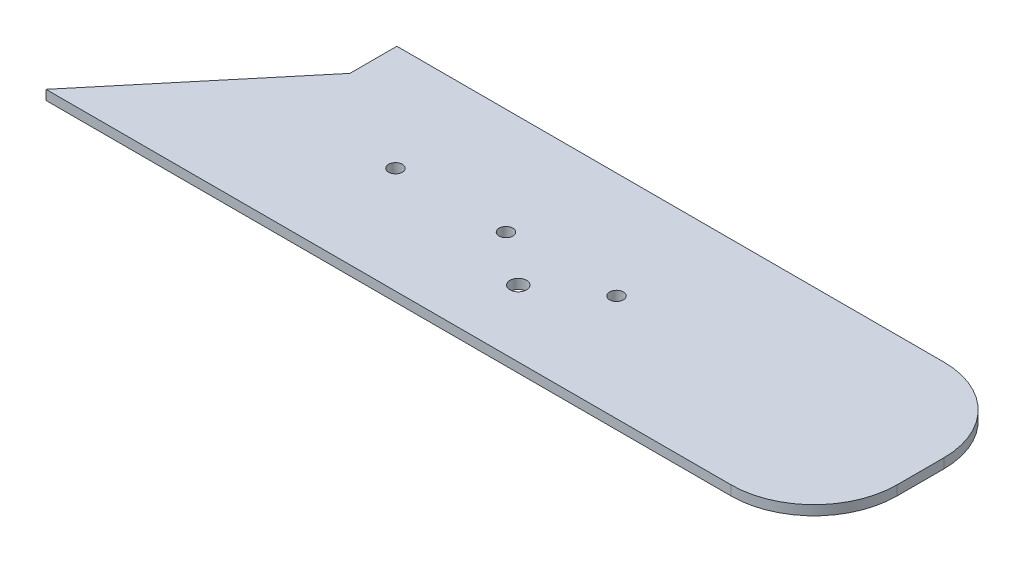
ISO-10303-21;
HEADER;
FILE_DESCRIPTION(('STEP AP214'),'2;1');
FILE_NAME('part.step','',(''),(''),'','','');
FILE_SCHEMA(('AUTOMOTIVE_DESIGN { 1 0 10303 214 1 1 1 1 }'));
ENDSEC;
DATA;
#1=APPLICATION_CONTEXT('core data for automotive mechanical design processes');
#2=APPLICATION_PROTOCOL_DEFINITION('international standard','automotive_design',2000,#1);
#3=PRODUCT_CONTEXT('',#1,'mechanical');
#4=PRODUCT('Part','Part','',(#3));
#5=PRODUCT_RELATED_PRODUCT_CATEGORY('part','',(#4));
#6=PRODUCT_DEFINITION_FORMATION('','',#4);
#7=PRODUCT_DEFINITION_CONTEXT('part definition',#1,'design');
#8=PRODUCT_DEFINITION('design','',#6,#7);
#9=PRODUCT_DEFINITION_SHAPE('','',#8);
#10=(LENGTH_UNIT() NAMED_UNIT(*) SI_UNIT(.MILLI.,.METRE.));
#11=(NAMED_UNIT(*) PLANE_ANGLE_UNIT() SI_UNIT($,.RADIAN.));
#12=(NAMED_UNIT(*) SI_UNIT($,.STERADIAN.) SOLID_ANGLE_UNIT());
#13=UNCERTAINTY_MEASURE_WITH_UNIT(LENGTH_MEASURE(1.E-05),#10,'distance_accuracy_value','');
#14=(GEOMETRIC_REPRESENTATION_CONTEXT(3) GLOBAL_UNCERTAINTY_ASSIGNED_CONTEXT((#13)) GLOBAL_UNIT_ASSIGNED_CONTEXT((#10,
#11,#12)) REPRESENTATION_CONTEXT('',''));
#15=CARTESIAN_POINT('',(0.,0.,0.));
#16=DIRECTION('',(0.,0.,1.));
#17=DIRECTION('',(1.,0.,0.));
#18=AXIS2_PLACEMENT_3D('',#15,#16,#17);
#19=CARTESIAN_POINT('',(229.915267771114,3.5,-22.0175326659419));
#20=DIRECTION('',(0.,1.,0.));
#21=DIRECTION('',(0.,0.,1.));
#22=AXIS2_PLACEMENT_3D('',#19,#20,#21);
#23=PLANE('',#22);
#24=CARTESIAN_POINT('',(128.742770500111,3.5,-16.1298360382122));
#25=DIRECTION('',(0.,1.,0.));
#26=DIRECTION('',(0.,0.,1.));
#27=AXIS2_PLACEMENT_3D('',#24,#25,#26);
#28=CIRCLE('',#27,2.99999999999998);
#29=CARTESIAN_POINT('',(128.742770500111,3.5,-13.1298360382122));
#30=VERTEX_POINT('',#29);
#31=EDGE_CURVE('E186',#30,#30,#28,.T.);
#32=ORIENTED_EDGE('',*,*,#31,.F.);
#33=EDGE_LOOP('',(#32));
#34=FACE_BOUND('',#33,.T.);
#35=CARTESIAN_POINT('',(109.915267771114,3.5,-30.5175326659419));
#36=DIRECTION('',(0.,1.,0.));
#37=DIRECTION('',(0.,0.,1.));
#38=AXIS2_PLACEMENT_3D('',#35,#36,#37);
#39=CIRCLE('',#38,2.5);
#40=CARTESIAN_POINT('',(109.915267771114,3.5,-28.0175326659419));
#41=VERTEX_POINT('',#40);
#42=EDGE_CURVE('E174',#41,#41,#39,.T.);
#43=ORIENTED_EDGE('',*,*,#42,.F.);
#44=EDGE_LOOP('',(#43));
#45=FACE_BOUND('',#44,.T.);
#46=DIRECTION('',(0.,0.,1.));
#47=VECTOR('',#46,1.);
#48=CARTESIAN_POINT('',(31.9152677711139,3.5,-69.0175326659418));
#49=LINE('',#48,#47);
#50=CARTESIAN_POINT('',(31.9152677711139,3.5,-69.0175326659418));
#51=VERTEX_POINT('',#50);
#52=CARTESIAN_POINT('',(31.9152677711139,3.5,-52.0175326659419));
#53=VERTEX_POINT('',#52);
#54=EDGE_CURVE('E98',#51,#53,#49,.T.);
#55=ORIENTED_EDGE('',*,*,#54,.T.);
#56=DIRECTION('',(-0.64018439966448,0.,0.768221279597376));
#57=VECTOR('',#56,1.);
#58=CARTESIAN_POINT('',(-18.0847322288861,3.5,7.9824673340581));
#59=LINE('',#58,#57);
#60=CARTESIAN_POINT('',(-18.0847322288861,3.5,7.9824673340581));
#61=VERTEX_POINT('',#60);
#62=EDGE_CURVE('E166',#53,#61,#59,.T.);
#63=ORIENTED_EDGE('',*,*,#62,.T.);
#64=DIRECTION('',(1.,0.,0.));
#65=VECTOR('',#64,1.);
#66=CARTESIAN_POINT('',(-18.0847322288861,3.5,7.9824673340581));
#67=LINE('',#66,#65);
#68=CARTESIAN_POINT('',(229.915267771114,3.5,7.98246733405811));
#69=VERTEX_POINT('',#68);
#70=EDGE_CURVE('E158',#61,#69,#67,.T.);
#71=ORIENTED_EDGE('',*,*,#70,.T.);
#72=CARTESIAN_POINT('',(229.915267771114,3.5,-22.0175326659419));
#73=DIRECTION('',(0.,1.,0.));
#74=DIRECTION('',(0.,0.,1.));
#75=AXIS2_PLACEMENT_3D('',#72,#73,#74);
#76=CIRCLE('',#75,30.);
#77=CARTESIAN_POINT('',(259.915267771114,3.5,-22.0175326659421));
#78=VERTEX_POINT('',#77);
#79=EDGE_CURVE('E115',#69,#78,#76,.T.);
#80=ORIENTED_EDGE('',*,*,#79,.T.);
#81=DIRECTION('',(0.,0.,-1.));
#82=VECTOR('',#81,1.);
#83=CARTESIAN_POINT('',(259.915267771114,3.5,-22.0175326659421));
#84=LINE('',#83,#82);
#85=CARTESIAN_POINT('',(259.915267771114,3.5,-39.0175326659419));
#86=VERTEX_POINT('',#85);
#87=EDGE_CURVE('E109',#78,#86,#84,.T.);
#88=ORIENTED_EDGE('',*,*,#87,.T.);
#89=CARTESIAN_POINT('',(229.915267771114,3.5,-39.0175326659419));
#90=DIRECTION('',(0.,1.,0.));
#91=DIRECTION('',(0.,0.,1.));
#92=AXIS2_PLACEMENT_3D('',#89,#90,#91);
#93=CIRCLE('',#92,30.);
#94=CARTESIAN_POINT('',(229.915267771114,3.5,-69.0175326659419));
#95=VERTEX_POINT('',#94);
#96=EDGE_CURVE('E113',#86,#95,#93,.T.);
#97=ORIENTED_EDGE('',*,*,#96,.T.);
#98=DIRECTION('',(-1.,0.,0.));
#99=VECTOR('',#98,1.);
#100=CARTESIAN_POINT('',(229.915267771114,3.5,-69.0175326659419));
#101=LINE('',#100,#99);
#102=EDGE_CURVE('E59',#95,#51,#101,.T.);
#103=ORIENTED_EDGE('',*,*,#102,.T.);
#104=EDGE_LOOP('',(#55,#63,#71,#80,#88,#97,#103));
#105=FACE_BOUND('',#104,.T.);
#106=CARTESIAN_POINT('',(149.915267771114,3.5,-30.5175326659419));
#107=DIRECTION('',(0.,1.,0.));
#108=DIRECTION('',(0.,0.,1.));
#109=AXIS2_PLACEMENT_3D('',#106,#107,#108);
#110=CIRCLE('',#109,2.5);
#111=CARTESIAN_POINT('',(149.915267771114,3.5,-28.0175326659419));
#112=VERTEX_POINT('',#111);
#113=EDGE_CURVE('E135',#112,#112,#110,.T.);
#114=ORIENTED_EDGE('',*,*,#113,.F.);
#115=EDGE_LOOP('',(#114));
#116=FACE_BOUND('',#115,.T.);
#117=CARTESIAN_POINT('',(69.9152677711139,3.5,-30.5175326659419));
#118=DIRECTION('',(0.,1.,0.));
#119=DIRECTION('',(0.,0.,1.));
#120=AXIS2_PLACEMENT_3D('',#117,#118,#119);
#121=CIRCLE('',#120,2.5);
#122=CARTESIAN_POINT('',(69.9152677711139,3.5,-28.0175326659419));
#123=VERTEX_POINT('',#122);
#124=EDGE_CURVE('E180',#123,#123,#121,.T.);
#125=ORIENTED_EDGE('',*,*,#124,.F.);
#126=EDGE_LOOP('',(#125));
#127=FACE_BOUND('',#126,.T.);
#128=ADVANCED_FACE('F42',(#34,#45,#105,#116,#127),#23,.T.);
#129=CARTESIAN_POINT('',(229.915267771114,0.,-22.0175326659419));
#130=DIRECTION('',(0.,1.,0.));
#131=DIRECTION('',(0.,0.,1.));
#132=AXIS2_PLACEMENT_3D('',#129,#130,#131);
#133=PLANE('',#132);
#134=CARTESIAN_POINT('',(128.742770500111,0.,-16.1298360382122));
#135=DIRECTION('',(0.,1.,0.));
#136=DIRECTION('',(0.,0.,1.));
#137=AXIS2_PLACEMENT_3D('',#134,#135,#136);
#138=CIRCLE('',#137,2.99999999999995);
#139=CARTESIAN_POINT('',(128.742770500111,0.,-13.1298360382122));
#140=VERTEX_POINT('',#139);
#141=EDGE_CURVE('E191',#140,#140,#138,.T.);
#142=ORIENTED_EDGE('',*,*,#141,.T.);
#143=EDGE_LOOP('',(#142));
#144=FACE_BOUND('',#143,.T.);
#145=DIRECTION('',(0.,0.,1.));
#146=VECTOR('',#145,1.);
#147=CARTESIAN_POINT('',(31.9152677711139,0.,-65.5175326659418));
#148=LINE('',#147,#146);
#149=CARTESIAN_POINT('',(31.9152677711139,0.,-69.0175326659418));
#150=VERTEX_POINT('',#149);
#151=CARTESIAN_POINT('',(31.9152677711139,0.,-52.0175326659419));
#152=VERTEX_POINT('',#151);
#153=EDGE_CURVE('E92',#150,#152,#148,.T.);
#154=ORIENTED_EDGE('',*,*,#153,.F.);
#155=DIRECTION('',(-1.,0.,0.));
#156=VECTOR('',#155,1.);
#157=CARTESIAN_POINT('',(229.915267771114,0.,-69.0175326659419));
#158=LINE('',#157,#156);
#159=CARTESIAN_POINT('',(229.915267771114,0.,-69.0175326659419));
#160=VERTEX_POINT('',#159);
#161=EDGE_CURVE('E143',#160,#150,#158,.T.);
#162=ORIENTED_EDGE('',*,*,#161,.F.);
#163=CARTESIAN_POINT('',(229.915267771114,0.,-39.0175326659419));
#164=DIRECTION('',(0.,1.,0.));
#165=DIRECTION('',(0.,0.,1.));
#166=AXIS2_PLACEMENT_3D('',#163,#164,#165);
#167=CIRCLE('',#166,30.);
#168=CARTESIAN_POINT('',(259.915267771114,0.,-39.0175326659419));
#169=VERTEX_POINT('',#168);
#170=EDGE_CURVE('E85',#169,#160,#167,.T.);
#171=ORIENTED_EDGE('',*,*,#170,.F.);
#172=DIRECTION('',(0.,0.,-1.));
#173=VECTOR('',#172,1.);
#174=CARTESIAN_POINT('',(259.915267771114,0.,-22.0175326659421));
#175=LINE('',#174,#173);
#176=CARTESIAN_POINT('',(259.915267771114,0.,-22.0175326659421));
#177=VERTEX_POINT('',#176);
#178=EDGE_CURVE('E123',#177,#169,#175,.T.);
#179=ORIENTED_EDGE('',*,*,#178,.F.);
#180=CARTESIAN_POINT('',(229.915267771114,0.,-22.0175326659419));
#181=DIRECTION('',(0.,1.,0.));
#182=DIRECTION('',(0.,0.,1.));
#183=AXIS2_PLACEMENT_3D('',#180,#181,#182);
#184=CIRCLE('',#183,30.);
#185=CARTESIAN_POINT('',(229.915267771114,0.,7.98246733405811));
#186=VERTEX_POINT('',#185);
#187=EDGE_CURVE('E139',#186,#177,#184,.T.);
#188=ORIENTED_EDGE('',*,*,#187,.F.);
#189=DIRECTION('',(1.,0.,0.));
#190=VECTOR('',#189,1.);
#191=CARTESIAN_POINT('',(-18.0847322288861,0.,7.9824673340581));
#192=LINE('',#191,#190);
#193=CARTESIAN_POINT('',(-18.0847322288861,0.,7.9824673340581));
#194=VERTEX_POINT('',#193);
#195=EDGE_CURVE('E137',#194,#186,#192,.T.);
#196=ORIENTED_EDGE('',*,*,#195,.F.);
#197=DIRECTION('',(-0.64018439966448,0.,0.768221279597376));
#198=VECTOR('',#197,1.);
#199=CARTESIAN_POINT('',(-18.0847322288861,0.,7.9824673340581));
#200=LINE('',#199,#198);
#201=EDGE_CURVE('E134',#152,#194,#200,.T.);
#202=ORIENTED_EDGE('',*,*,#201,.F.);
#203=EDGE_LOOP('',(#154,#162,#171,#179,#188,#196,#202));
#204=FACE_BOUND('',#203,.T.);
#205=CARTESIAN_POINT('',(149.915267771114,0.,-30.5175326659419));
#206=DIRECTION('',(0.,1.,0.));
#207=DIRECTION('',(0.,0.,1.));
#208=AXIS2_PLACEMENT_3D('',#205,#206,#207);
#209=CIRCLE('',#208,2.5);
#210=CARTESIAN_POINT('',(149.915267771114,0.,-28.0175326659419));
#211=VERTEX_POINT('',#210);
#212=EDGE_CURVE('E171',#211,#211,#209,.T.);
#213=ORIENTED_EDGE('',*,*,#212,.T.);
#214=EDGE_LOOP('',(#213));
#215=FACE_BOUND('',#214,.T.);
#216=CARTESIAN_POINT('',(109.915267771114,0.,-30.5175326659419));
#217=DIRECTION('',(0.,1.,0.));
#218=DIRECTION('',(0.,0.,1.));
#219=AXIS2_PLACEMENT_3D('',#216,#217,#218);
#220=CIRCLE('',#219,2.5);
#221=CARTESIAN_POINT('',(109.915267771114,0.,-28.0175326659419));
#222=VERTEX_POINT('',#221);
#223=EDGE_CURVE('E177',#222,#222,#220,.T.);
#224=ORIENTED_EDGE('',*,*,#223,.T.);
#225=EDGE_LOOP('',(#224));
#226=FACE_BOUND('',#225,.T.);
#227=CARTESIAN_POINT('',(69.9152677711139,0.,-30.5175326659419));
#228=DIRECTION('',(0.,1.,0.));
#229=DIRECTION('',(0.,0.,1.));
#230=AXIS2_PLACEMENT_3D('',#227,#228,#229);
#231=CIRCLE('',#230,2.5);
#232=CARTESIAN_POINT('',(69.9152677711139,0.,-28.0175326659419));
#233=VERTEX_POINT('',#232);
#234=EDGE_CURVE('E183',#233,#233,#231,.T.);
#235=ORIENTED_EDGE('',*,*,#234,.T.);
#236=EDGE_LOOP('',(#235));
#237=FACE_BOUND('',#236,.T.);
#238=ADVANCED_FACE('F162',(#144,#204,#215,#226,#237),#133,.F.);
#239=CARTESIAN_POINT('',(31.9152677711139,3.5,-65.5175326659418));
#240=DIRECTION('',(1.,0.,0.));
#241=DIRECTION('',(0.,0.,-1.));
#242=AXIS2_PLACEMENT_3D('',#239,#240,#241);
#243=PLANE('',#242);
#244=ORIENTED_EDGE('',*,*,#153,.T.);
#245=DIRECTION('',(0.,-1.,0.));
#246=VECTOR('',#245,1.);
#247=CARTESIAN_POINT('',(31.9152677711139,3.5,-52.0175326659419));
#248=LINE('',#247,#246);
#249=EDGE_CURVE('E11',#53,#152,#248,.T.);
#250=ORIENTED_EDGE('',*,*,#249,.F.);
#251=ORIENTED_EDGE('',*,*,#54,.F.);
#252=DIRECTION('',(0.,-1.,0.));
#253=VECTOR('',#252,1.);
#254=CARTESIAN_POINT('',(31.9152677711139,3.5,-69.0175326659418));
#255=LINE('',#254,#253);
#256=EDGE_CURVE('E129',#51,#150,#255,.T.);
#257=ORIENTED_EDGE('',*,*,#256,.T.);
#258=EDGE_LOOP('',(#244,#250,#251,#257));
#259=FACE_BOUND('',#258,.T.);
#260=ADVANCED_FACE('F44',(#259),#243,.F.);
#261=CARTESIAN_POINT('',(-18.0847322288861,3.5,7.9824673340581));
#262=DIRECTION('',(0.768221279597376,0.,0.64018439966448));
#263=DIRECTION('',(0.64018439966448,0.,-0.768221279597376));
#264=AXIS2_PLACEMENT_3D('',#261,#262,#263);
#265=PLANE('',#264);
#266=ORIENTED_EDGE('',*,*,#201,.T.);
#267=DIRECTION('',(0.,-1.,0.));
#268=VECTOR('',#267,1.);
#269=CARTESIAN_POINT('',(-18.0847322288861,3.5,7.9824673340581));
#270=LINE('',#269,#268);
#271=EDGE_CURVE('E51',#61,#194,#270,.T.);
#272=ORIENTED_EDGE('',*,*,#271,.F.);
#273=ORIENTED_EDGE('',*,*,#62,.F.);
#274=ORIENTED_EDGE('',*,*,#249,.T.);
#275=EDGE_LOOP('',(#266,#272,#273,#274));
#276=FACE_BOUND('',#275,.T.);
#277=ADVANCED_FACE('F232',(#276),#265,.F.);
#278=CARTESIAN_POINT('',(-18.0847322288861,3.5,7.9824673340581));
#279=DIRECTION('',(0.,0.,-1.));
#280=DIRECTION('',(-1.,0.,0.));
#281=AXIS2_PLACEMENT_3D('',#278,#279,#280);
#282=PLANE('',#281);
#283=ORIENTED_EDGE('',*,*,#195,.T.);
#284=DIRECTION('',(0.,-1.,0.));
#285=VECTOR('',#284,1.);
#286=CARTESIAN_POINT('',(229.915267771114,3.5,7.98246733405811));
#287=LINE('',#286,#285);
#288=EDGE_CURVE('E149',#69,#186,#287,.T.);
#289=ORIENTED_EDGE('',*,*,#288,.F.);
#290=ORIENTED_EDGE('',*,*,#70,.F.);
#291=ORIENTED_EDGE('',*,*,#271,.T.);
#292=EDGE_LOOP('',(#283,#289,#290,#291));
#293=FACE_BOUND('',#292,.T.);
#294=ADVANCED_FACE('F156',(#293),#282,.F.);
#295=CARTESIAN_POINT('',(229.915267771114,3.5,-22.0175326659419));
#296=DIRECTION('',(0.,-1.,0.));
#297=DIRECTION('',(0.,0.,-1.));
#298=AXIS2_PLACEMENT_3D('',#295,#296,#297);
#299=CYLINDRICAL_SURFACE('',#298,30.);
#300=ORIENTED_EDGE('',*,*,#187,.T.);
#301=DIRECTION('',(0.,-1.,0.));
#302=VECTOR('',#301,1.);
#303=CARTESIAN_POINT('',(259.915267771114,3.5,-22.0175326659421));
#304=LINE('',#303,#302);
#305=EDGE_CURVE('E124',#78,#177,#304,.T.);
#306=ORIENTED_EDGE('',*,*,#305,.F.);
#307=ORIENTED_EDGE('',*,*,#79,.F.);
#308=ORIENTED_EDGE('',*,*,#288,.T.);
#309=EDGE_LOOP('',(#300,#306,#307,#308));
#310=FACE_BOUND('',#309,.T.);
#311=ADVANCED_FACE('F165',(#310),#299,.T.);
#312=CARTESIAN_POINT('',(259.915267771114,3.5,-22.0175326659421));
#313=DIRECTION('',(-1.,0.,0.));
#314=DIRECTION('',(0.,0.,1.));
#315=AXIS2_PLACEMENT_3D('',#312,#313,#314);
#316=PLANE('',#315);
#317=ORIENTED_EDGE('',*,*,#178,.T.);
#318=DIRECTION('',(0.,-1.,0.));
#319=VECTOR('',#318,1.);
#320=CARTESIAN_POINT('',(259.915267771114,3.5,-39.0175326659419));
#321=LINE('',#320,#319);
#322=EDGE_CURVE('E120',#86,#169,#321,.T.);
#323=ORIENTED_EDGE('',*,*,#322,.F.);
#324=ORIENTED_EDGE('',*,*,#87,.F.);
#325=ORIENTED_EDGE('',*,*,#305,.T.);
#326=EDGE_LOOP('',(#317,#323,#324,#325));
#327=FACE_BOUND('',#326,.T.);
#328=ADVANCED_FACE('F121',(#327),#316,.F.);
#329=CARTESIAN_POINT('',(229.915267771114,3.5,-39.0175326659419));
#330=DIRECTION('',(0.,-1.,0.));
#331=DIRECTION('',(0.,0.,-1.));
#332=AXIS2_PLACEMENT_3D('',#329,#330,#331);
#333=CYLINDRICAL_SURFACE('',#332,30.);
#334=ORIENTED_EDGE('',*,*,#170,.T.);
#335=DIRECTION('',(0.,-1.,0.));
#336=VECTOR('',#335,1.);
#337=CARTESIAN_POINT('',(229.915267771114,3.5,-69.0175326659419));
#338=LINE('',#337,#336);
#339=EDGE_CURVE('E125',#95,#160,#338,.T.);
#340=ORIENTED_EDGE('',*,*,#339,.F.);
#341=ORIENTED_EDGE('',*,*,#96,.F.);
#342=ORIENTED_EDGE('',*,*,#322,.T.);
#343=EDGE_LOOP('',(#334,#340,#341,#342));
#344=FACE_BOUND('',#343,.T.);
#345=ADVANCED_FACE('F127',(#344),#333,.T.);
#346=CARTESIAN_POINT('',(229.915267771114,3.5,-69.0175326659419));
#347=DIRECTION('',(0.,0.,1.));
#348=DIRECTION('',(1.,0.,0.));
#349=AXIS2_PLACEMENT_3D('',#346,#347,#348);
#350=PLANE('',#349);
#351=ORIENTED_EDGE('',*,*,#161,.T.);
#352=ORIENTED_EDGE('',*,*,#256,.F.);
#353=ORIENTED_EDGE('',*,*,#102,.F.);
#354=ORIENTED_EDGE('',*,*,#339,.T.);
#355=EDGE_LOOP('',(#351,#352,#353,#354));
#356=FACE_BOUND('',#355,.T.);
#357=ADVANCED_FACE('F221',(#356),#350,.F.);
#358=CARTESIAN_POINT('',(149.915267771114,3.5,-30.5175326659419));
#359=DIRECTION('',(0.,-1.,0.));
#360=DIRECTION('',(0.,0.,-1.));
#361=AXIS2_PLACEMENT_3D('',#358,#359,#360);
#362=CYLINDRICAL_SURFACE('',#361,2.5);
#363=ORIENTED_EDGE('',*,*,#113,.T.);
#364=EDGE_LOOP('',(#363));
#365=FACE_BOUND('',#364,.T.);
#366=ORIENTED_EDGE('',*,*,#212,.F.);
#367=EDGE_LOOP('',(#366));
#368=FACE_BOUND('',#367,.T.);
#369=ADVANCED_FACE('F218',(#365,#368),#362,.F.);
#370=CARTESIAN_POINT('',(109.915267771114,3.5,-30.5175326659419));
#371=DIRECTION('',(0.,-1.,0.));
#372=DIRECTION('',(0.,0.,-1.));
#373=AXIS2_PLACEMENT_3D('',#370,#371,#372);
#374=CYLINDRICAL_SURFACE('',#373,2.5);
#375=ORIENTED_EDGE('',*,*,#42,.T.);
#376=EDGE_LOOP('',(#375));
#377=FACE_BOUND('',#376,.T.);
#378=ORIENTED_EDGE('',*,*,#223,.F.);
#379=EDGE_LOOP('',(#378));
#380=FACE_BOUND('',#379,.T.);
#381=ADVANCED_FACE('F204',(#377,#380),#374,.F.);
#382=CARTESIAN_POINT('',(69.9152677711139,3.5,-30.5175326659419));
#383=DIRECTION('',(0.,-1.,0.));
#384=DIRECTION('',(0.,0.,-1.));
#385=AXIS2_PLACEMENT_3D('',#382,#383,#384);
#386=CYLINDRICAL_SURFACE('',#385,2.5);
#387=ORIENTED_EDGE('',*,*,#124,.T.);
#388=EDGE_LOOP('',(#387));
#389=FACE_BOUND('',#388,.T.);
#390=ORIENTED_EDGE('',*,*,#234,.F.);
#391=EDGE_LOOP('',(#390));
#392=FACE_BOUND('',#391,.T.);
#393=ADVANCED_FACE('F198',(#389,#392),#386,.F.);
#394=CARTESIAN_POINT('',(128.742770500111,261.5,-16.1298360382121));
#395=DIRECTION('',(0.,1.,0.));
#396=DIRECTION('',(0.,0.,1.));
#397=AXIS2_PLACEMENT_3D('',#394,#395,#396);
#398=CYLINDRICAL_SURFACE('',#397,2.99999999999998);
#399=ORIENTED_EDGE('',*,*,#31,.T.);
#400=EDGE_LOOP('',(#399));
#401=FACE_BOUND('',#400,.T.);
#402=ORIENTED_EDGE('',*,*,#141,.F.);
#403=EDGE_LOOP('',(#402));
#404=FACE_BOUND('',#403,.T.);
#405=ADVANCED_FACE('F196',(#401,#404),#398,.F.);
#406=CLOSED_SHELL('',(#128,#238,#260,#277,#294,#311,#328,#345,#357,#369,#381,#393,#405));
#407=MANIFOLD_SOLID_BREP('B2',#406);
#408=ADVANCED_BREP_SHAPE_REPRESENTATION('',(#18,#407),#14);
#409=SHAPE_DEFINITION_REPRESENTATION(#9,#408);
ENDSEC;
END-ISO-10303-21;
